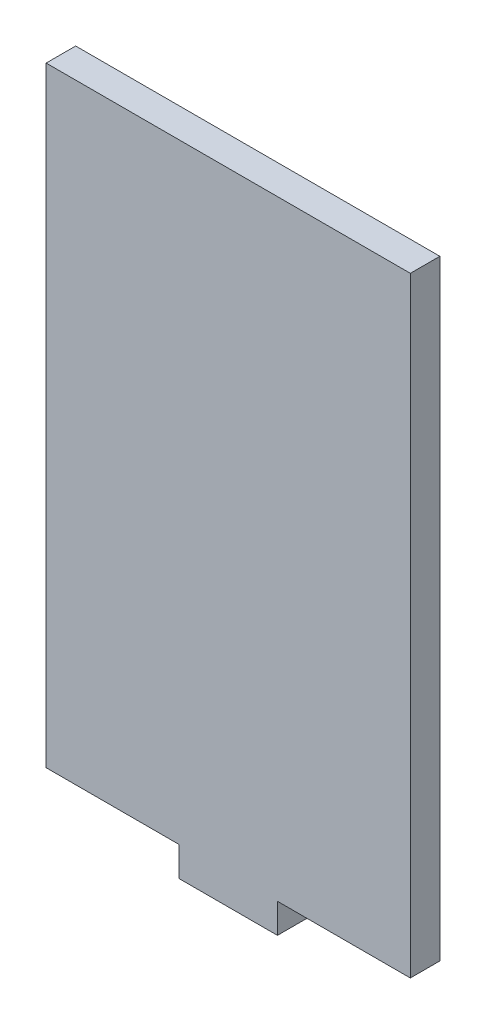
ISO-10303-21;
HEADER;
FILE_DESCRIPTION(('STEP AP214'),'2;1');
FILE_NAME('part.step','',(''),(''),'','','');
FILE_SCHEMA(('AUTOMOTIVE_DESIGN { 1 0 10303 214 1 1 1 1 }'));
ENDSEC;
DATA;
#1=APPLICATION_CONTEXT('core data for automotive mechanical design processes');
#2=APPLICATION_PROTOCOL_DEFINITION('international standard','automotive_design',2000,#1);
#3=PRODUCT_CONTEXT('',#1,'mechanical');
#4=PRODUCT('Part','Part','',(#3));
#5=PRODUCT_RELATED_PRODUCT_CATEGORY('part','',(#4));
#6=PRODUCT_DEFINITION_FORMATION('','',#4);
#7=PRODUCT_DEFINITION_CONTEXT('part definition',#1,'design');
#8=PRODUCT_DEFINITION('design','',#6,#7);
#9=PRODUCT_DEFINITION_SHAPE('','',#8);
#10=(LENGTH_UNIT() NAMED_UNIT(*) SI_UNIT(.MILLI.,.METRE.));
#11=(NAMED_UNIT(*) PLANE_ANGLE_UNIT() SI_UNIT($,.RADIAN.));
#12=(NAMED_UNIT(*) SI_UNIT($,.STERADIAN.) SOLID_ANGLE_UNIT());
#13=UNCERTAINTY_MEASURE_WITH_UNIT(LENGTH_MEASURE(1.E-05),#10,'distance_accuracy_value','');
#14=(GEOMETRIC_REPRESENTATION_CONTEXT(3) GLOBAL_UNCERTAINTY_ASSIGNED_CONTEXT((#13)) GLOBAL_UNIT_ASSIGNED_CONTEXT((#10,
#11,#12)) REPRESENTATION_CONTEXT('',''));
#15=CARTESIAN_POINT('',(0.,0.,0.));
#16=DIRECTION('',(0.,0.,1.));
#17=DIRECTION('',(1.,0.,0.));
#18=AXIS2_PLACEMENT_3D('',#15,#16,#17);
#19=CARTESIAN_POINT('',(0.,0.,3.));
#20=DIRECTION('',(1.,0.,0.));
#21=DIRECTION('',(0.,1.,0.));
#22=AXIS2_PLACEMENT_3D('',#19,#20,#21);
#23=PLANE('',#22);
#24=DIRECTION('',(0.,-1.,0.));
#25=VECTOR('',#24,1.);
#26=CARTESIAN_POINT('',(0.,0.,0.));
#27=LINE('',#26,#25);
#28=CARTESIAN_POINT('',(0.,62.,0.));
#29=VERTEX_POINT('',#28);
#30=CARTESIAN_POINT('',(0.,0.,0.));
#31=VERTEX_POINT('',#30);
#32=EDGE_CURVE('E129',#29,#31,#27,.T.);
#33=ORIENTED_EDGE('',*,*,#32,.T.);
#34=DIRECTION('',(0.,0.,-1.));
#35=VECTOR('',#34,1.);
#36=CARTESIAN_POINT('',(0.,0.,3.));
#37=LINE('',#36,#35);
#38=CARTESIAN_POINT('',(0.,0.,3.));
#39=VERTEX_POINT('',#38);
#40=EDGE_CURVE('E11',#39,#31,#37,.T.);
#41=ORIENTED_EDGE('',*,*,#40,.F.);
#42=DIRECTION('',(0.,-1.,0.));
#43=VECTOR('',#42,1.);
#44=CARTESIAN_POINT('',(0.,0.,3.));
#45=LINE('',#44,#43);
#46=CARTESIAN_POINT('',(0.,62.,3.));
#47=VERTEX_POINT('',#46);
#48=EDGE_CURVE('E143',#47,#39,#45,.T.);
#49=ORIENTED_EDGE('',*,*,#48,.F.);
#50=DIRECTION('',(0.,0.,-1.));
#51=VECTOR('',#50,1.);
#52=CARTESIAN_POINT('',(0.,62.,3.));
#53=LINE('',#52,#51);
#54=EDGE_CURVE('E125',#47,#29,#53,.T.);
#55=ORIENTED_EDGE('',*,*,#54,.T.);
#56=EDGE_LOOP('',(#33,#41,#49,#55));
#57=FACE_BOUND('',#56,.T.);
#58=ADVANCED_FACE('F33',(#57),#23,.F.);
#59=CARTESIAN_POINT('',(0.,0.,3.));
#60=DIRECTION('',(0.,1.,0.));
#61=DIRECTION('',(0.,0.,1.));
#62=AXIS2_PLACEMENT_3D('',#59,#60,#61);
#63=PLANE('',#62);
#64=DIRECTION('',(1.,0.,0.));
#65=VECTOR('',#64,1.);
#66=CARTESIAN_POINT('',(0.,0.,0.));
#67=LINE('',#66,#65);
#68=CARTESIAN_POINT('',(13.5,0.,0.));
#69=VERTEX_POINT('',#68);
#70=EDGE_CURVE('E132',#31,#69,#67,.T.);
#71=ORIENTED_EDGE('',*,*,#70,.T.);
#72=DIRECTION('',(0.,0.,-1.));
#73=VECTOR('',#72,1.);
#74=CARTESIAN_POINT('',(13.5,0.,3.));
#75=LINE('',#74,#73);
#76=CARTESIAN_POINT('',(13.5,0.,3.));
#77=VERTEX_POINT('',#76);
#78=EDGE_CURVE('E41',#77,#69,#75,.T.);
#79=ORIENTED_EDGE('',*,*,#78,.F.);
#80=DIRECTION('',(1.,0.,0.));
#81=VECTOR('',#80,1.);
#82=CARTESIAN_POINT('',(0.,0.,3.));
#83=LINE('',#82,#81);
#84=EDGE_CURVE('E92',#39,#77,#83,.T.);
#85=ORIENTED_EDGE('',*,*,#84,.F.);
#86=ORIENTED_EDGE('',*,*,#40,.T.);
#87=EDGE_LOOP('',(#71,#79,#85,#86));
#88=FACE_BOUND('',#87,.T.);
#89=ADVANCED_FACE('F178',(#88),#63,.F.);
#90=CARTESIAN_POINT('',(13.5,0.,3.));
#91=DIRECTION('',(1.,0.,0.));
#92=DIRECTION('',(0.,0.,-1.));
#93=AXIS2_PLACEMENT_3D('',#90,#91,#92);
#94=PLANE('',#93);
#95=DIRECTION('',(0.,-1.,0.));
#96=VECTOR('',#95,1.);
#97=CARTESIAN_POINT('',(13.5,0.,0.));
#98=LINE('',#97,#96);
#99=CARTESIAN_POINT('',(13.5,-3.,0.));
#100=VERTEX_POINT('',#99);
#101=EDGE_CURVE('E134',#69,#100,#98,.T.);
#102=ORIENTED_EDGE('',*,*,#101,.T.);
#103=DIRECTION('',(0.,0.,-1.));
#104=VECTOR('',#103,1.);
#105=CARTESIAN_POINT('',(13.5,-3.,3.));
#106=LINE('',#105,#104);
#107=CARTESIAN_POINT('',(13.5,-3.,3.));
#108=VERTEX_POINT('',#107);
#109=EDGE_CURVE('E150',#108,#100,#106,.T.);
#110=ORIENTED_EDGE('',*,*,#109,.F.);
#111=DIRECTION('',(0.,-1.,0.));
#112=VECTOR('',#111,1.);
#113=CARTESIAN_POINT('',(13.5,0.,3.));
#114=LINE('',#113,#112);
#115=EDGE_CURVE('E158',#77,#108,#114,.T.);
#116=ORIENTED_EDGE('',*,*,#115,.F.);
#117=ORIENTED_EDGE('',*,*,#78,.T.);
#118=EDGE_LOOP('',(#102,#110,#116,#117));
#119=FACE_BOUND('',#118,.T.);
#120=ADVANCED_FACE('F156',(#119),#94,.F.);
#121=CARTESIAN_POINT('',(13.5,-3.,3.));
#122=DIRECTION('',(0.,1.,0.));
#123=DIRECTION('',(0.,0.,1.));
#124=AXIS2_PLACEMENT_3D('',#121,#122,#123);
#125=PLANE('',#124);
#126=DIRECTION('',(1.,0.,0.));
#127=VECTOR('',#126,1.);
#128=CARTESIAN_POINT('',(13.5,-3.,0.));
#129=LINE('',#128,#127);
#130=CARTESIAN_POINT('',(23.5,-3.,0.));
#131=VERTEX_POINT('',#130);
#132=EDGE_CURVE('E136',#100,#131,#129,.T.);
#133=ORIENTED_EDGE('',*,*,#132,.T.);
#134=DIRECTION('',(0.,0.,-1.));
#135=VECTOR('',#134,1.);
#136=CARTESIAN_POINT('',(23.5,-3.,3.));
#137=LINE('',#136,#135);
#138=CARTESIAN_POINT('',(23.5,-3.,3.));
#139=VERTEX_POINT('',#138);
#140=EDGE_CURVE('E147',#139,#131,#137,.T.);
#141=ORIENTED_EDGE('',*,*,#140,.F.);
#142=DIRECTION('',(1.,0.,0.));
#143=VECTOR('',#142,1.);
#144=CARTESIAN_POINT('',(13.5,-3.,3.));
#145=LINE('',#144,#143);
#146=EDGE_CURVE('E170',#108,#139,#145,.T.);
#147=ORIENTED_EDGE('',*,*,#146,.F.);
#148=ORIENTED_EDGE('',*,*,#109,.T.);
#149=EDGE_LOOP('',(#133,#141,#147,#148));
#150=FACE_BOUND('',#149,.T.);
#151=ADVANCED_FACE('F166',(#150),#125,.F.);
#152=CARTESIAN_POINT('',(23.5,0.,3.));
#153=DIRECTION('',(-1.,0.,0.));
#154=DIRECTION('',(0.,0.,1.));
#155=AXIS2_PLACEMENT_3D('',#152,#153,#154);
#156=PLANE('',#155);
#157=DIRECTION('',(0.,1.,0.));
#158=VECTOR('',#157,1.);
#159=CARTESIAN_POINT('',(23.5,0.,0.));
#160=LINE('',#159,#158);
#161=CARTESIAN_POINT('',(23.5,0.,0.));
#162=VERTEX_POINT('',#161);
#163=EDGE_CURVE('E138',#131,#162,#160,.T.);
#164=ORIENTED_EDGE('',*,*,#163,.T.);
#165=DIRECTION('',(0.,0.,-1.));
#166=VECTOR('',#165,1.);
#167=CARTESIAN_POINT('',(23.5,0.,3.));
#168=LINE('',#167,#166);
#169=CARTESIAN_POINT('',(23.5,0.,3.));
#170=VERTEX_POINT('',#169);
#171=EDGE_CURVE('E120',#170,#162,#168,.T.);
#172=ORIENTED_EDGE('',*,*,#171,.F.);
#173=DIRECTION('',(0.,1.,0.));
#174=VECTOR('',#173,1.);
#175=CARTESIAN_POINT('',(23.5,0.,3.));
#176=LINE('',#175,#174);
#177=EDGE_CURVE('E111',#139,#170,#176,.T.);
#178=ORIENTED_EDGE('',*,*,#177,.F.);
#179=ORIENTED_EDGE('',*,*,#140,.T.);
#180=EDGE_LOOP('',(#164,#172,#178,#179));
#181=FACE_BOUND('',#180,.T.);
#182=ADVANCED_FACE('F169',(#181),#156,.F.);
#183=CARTESIAN_POINT('',(23.5,0.,3.));
#184=DIRECTION('',(0.,1.,0.));
#185=DIRECTION('',(0.,0.,1.));
#186=AXIS2_PLACEMENT_3D('',#183,#184,#185);
#187=PLANE('',#186);
#188=DIRECTION('',(1.,0.,0.));
#189=VECTOR('',#188,1.);
#190=CARTESIAN_POINT('',(23.5,0.,0.));
#191=LINE('',#190,#189);
#192=CARTESIAN_POINT('',(37.,0.,0.));
#193=VERTEX_POINT('',#192);
#194=EDGE_CURVE('E119',#162,#193,#191,.T.);
#195=ORIENTED_EDGE('',*,*,#194,.T.);
#196=DIRECTION('',(0.,0.,-1.));
#197=VECTOR('',#196,1.);
#198=CARTESIAN_POINT('',(37.,0.,3.));
#199=LINE('',#198,#197);
#200=CARTESIAN_POINT('',(37.,0.,3.));
#201=VERTEX_POINT('',#200);
#202=EDGE_CURVE('E116',#201,#193,#199,.T.);
#203=ORIENTED_EDGE('',*,*,#202,.F.);
#204=DIRECTION('',(1.,0.,0.));
#205=VECTOR('',#204,1.);
#206=CARTESIAN_POINT('',(23.5,0.,3.));
#207=LINE('',#206,#205);
#208=EDGE_CURVE('E105',#170,#201,#207,.T.);
#209=ORIENTED_EDGE('',*,*,#208,.F.);
#210=ORIENTED_EDGE('',*,*,#171,.T.);
#211=EDGE_LOOP('',(#195,#203,#209,#210));
#212=FACE_BOUND('',#211,.T.);
#213=ADVANCED_FACE('F117',(#212),#187,.F.);
#214=CARTESIAN_POINT('',(37.,0.,3.));
#215=DIRECTION('',(-1.,0.,0.));
#216=DIRECTION('',(0.,-1.,0.));
#217=AXIS2_PLACEMENT_3D('',#214,#215,#216);
#218=PLANE('',#217);
#219=DIRECTION('',(0.,1.,0.));
#220=VECTOR('',#219,1.);
#221=CARTESIAN_POINT('',(37.,0.,0.));
#222=LINE('',#221,#220);
#223=CARTESIAN_POINT('',(37.,62.,0.));
#224=VERTEX_POINT('',#223);
#225=EDGE_CURVE('E78',#193,#224,#222,.T.);
#226=ORIENTED_EDGE('',*,*,#225,.T.);
#227=DIRECTION('',(0.,0.,-1.));
#228=VECTOR('',#227,1.);
#229=CARTESIAN_POINT('',(37.,62.,3.));
#230=LINE('',#229,#228);
#231=CARTESIAN_POINT('',(37.,62.,3.));
#232=VERTEX_POINT('',#231);
#233=EDGE_CURVE('E121',#232,#224,#230,.T.);
#234=ORIENTED_EDGE('',*,*,#233,.F.);
#235=DIRECTION('',(0.,1.,0.));
#236=VECTOR('',#235,1.);
#237=CARTESIAN_POINT('',(37.,0.,3.));
#238=LINE('',#237,#236);
#239=EDGE_CURVE('E109',#201,#232,#238,.T.);
#240=ORIENTED_EDGE('',*,*,#239,.F.);
#241=ORIENTED_EDGE('',*,*,#202,.T.);
#242=EDGE_LOOP('',(#226,#234,#240,#241));
#243=FACE_BOUND('',#242,.T.);
#244=ADVANCED_FACE('F123',(#243),#218,.F.);
#245=CARTESIAN_POINT('',(0.,62.,3.));
#246=DIRECTION('',(0.,-1.,0.));
#247=DIRECTION('',(0.,0.,-1.));
#248=AXIS2_PLACEMENT_3D('',#245,#246,#247);
#249=PLANE('',#248);
#250=DIRECTION('',(-1.,0.,0.));
#251=VECTOR('',#250,1.);
#252=CARTESIAN_POINT('',(0.,62.,0.));
#253=LINE('',#252,#251);
#254=EDGE_CURVE('E84',#224,#29,#253,.T.);
#255=ORIENTED_EDGE('',*,*,#254,.T.);
#256=ORIENTED_EDGE('',*,*,#54,.F.);
#257=DIRECTION('',(-1.,0.,0.));
#258=VECTOR('',#257,1.);
#259=CARTESIAN_POINT('',(0.,62.,3.));
#260=LINE('',#259,#258);
#261=EDGE_CURVE('E49',#232,#47,#260,.T.);
#262=ORIENTED_EDGE('',*,*,#261,.F.);
#263=ORIENTED_EDGE('',*,*,#233,.T.);
#264=EDGE_LOOP('',(#255,#256,#262,#263));
#265=FACE_BOUND('',#264,.T.);
#266=ADVANCED_FACE('F194',(#265),#249,.F.);
#267=CARTESIAN_POINT('',(0.,0.,3.));
#268=DIRECTION('',(0.,0.,-1.));
#269=DIRECTION('',(-1.,0.,0.));
#270=AXIS2_PLACEMENT_3D('',#267,#268,#269);
#271=PLANE('',#270);
#272=ORIENTED_EDGE('',*,*,#48,.T.);
#273=ORIENTED_EDGE('',*,*,#84,.T.);
#274=ORIENTED_EDGE('',*,*,#115,.T.);
#275=ORIENTED_EDGE('',*,*,#146,.T.);
#276=ORIENTED_EDGE('',*,*,#177,.T.);
#277=ORIENTED_EDGE('',*,*,#208,.T.);
#278=ORIENTED_EDGE('',*,*,#239,.T.);
#279=ORIENTED_EDGE('',*,*,#261,.T.);
#280=EDGE_LOOP('',(#272,#273,#274,#275,#276,#277,#278,#279));
#281=FACE_BOUND('',#280,.T.);
#282=ADVANCED_FACE('F107',(#281),#271,.F.);
#283=CARTESIAN_POINT('',(0.,0.,0.));
#284=DIRECTION('',(0.,0.,-1.));
#285=DIRECTION('',(-1.,0.,0.));
#286=AXIS2_PLACEMENT_3D('',#283,#284,#285);
#287=PLANE('',#286);
#288=ORIENTED_EDGE('',*,*,#32,.F.);
#289=ORIENTED_EDGE('',*,*,#254,.F.);
#290=ORIENTED_EDGE('',*,*,#225,.F.);
#291=ORIENTED_EDGE('',*,*,#194,.F.);
#292=ORIENTED_EDGE('',*,*,#163,.F.);
#293=ORIENTED_EDGE('',*,*,#132,.F.);
#294=ORIENTED_EDGE('',*,*,#101,.F.);
#295=ORIENTED_EDGE('',*,*,#70,.F.);
#296=EDGE_LOOP('',(#288,#289,#290,#291,#292,#293,#294,#295));
#297=FACE_BOUND('',#296,.T.);
#298=ADVANCED_FACE('F162',(#297),#287,.T.);
#299=CLOSED_SHELL('',(#58,#89,#120,#151,#182,#213,#244,#266,#282,#298));
#300=MANIFOLD_SOLID_BREP('B2',#299);
#301=ADVANCED_BREP_SHAPE_REPRESENTATION('',(#18,#300),#14);
#302=SHAPE_DEFINITION_REPRESENTATION(#9,#301);
ENDSEC;
END-ISO-10303-21;
